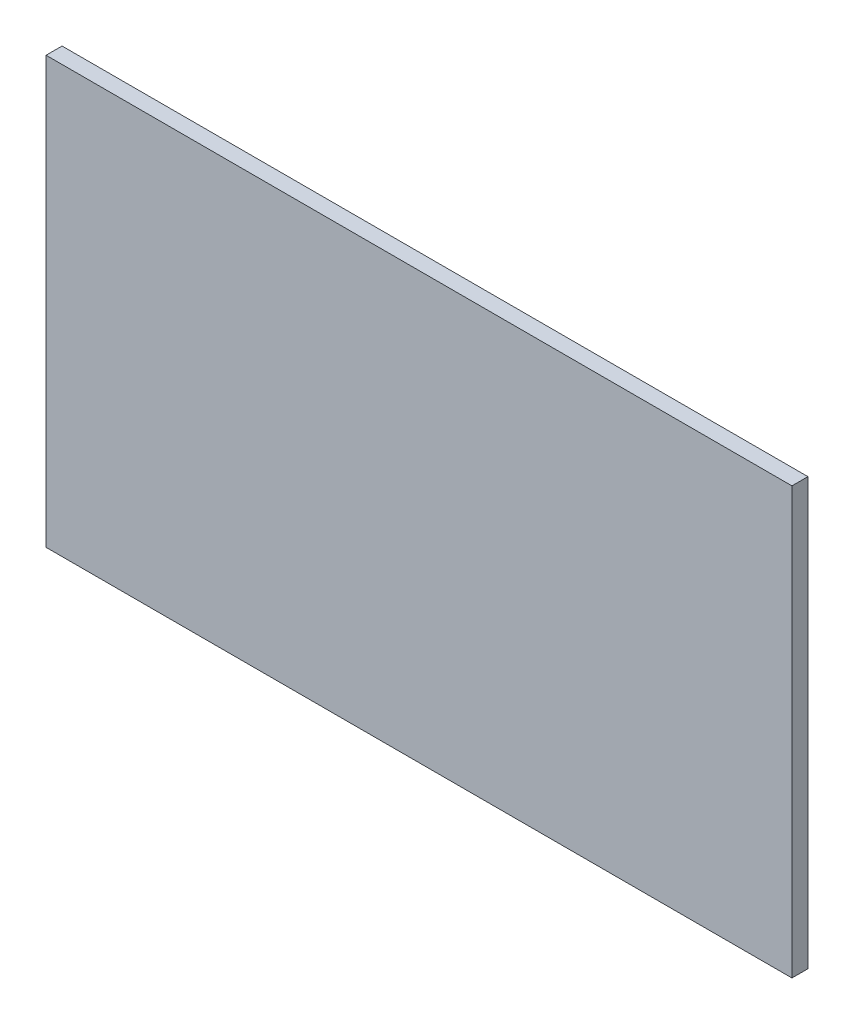
ISO-10303-21;
HEADER;
FILE_DESCRIPTION(('STEP AP214'),'2;1');
FILE_NAME('part.step','',(''),(''),'','','');
FILE_SCHEMA(('AUTOMOTIVE_DESIGN { 1 0 10303 214 1 1 1 1 }'));
ENDSEC;
DATA;
#1=APPLICATION_CONTEXT('core data for automotive mechanical design processes');
#2=APPLICATION_PROTOCOL_DEFINITION('international standard','automotive_design',2000,#1);
#3=PRODUCT_CONTEXT('',#1,'mechanical');
#4=PRODUCT('Part','Part','',(#3));
#5=PRODUCT_RELATED_PRODUCT_CATEGORY('part','',(#4));
#6=PRODUCT_DEFINITION_FORMATION('','',#4);
#7=PRODUCT_DEFINITION_CONTEXT('part definition',#1,'design');
#8=PRODUCT_DEFINITION('design','',#6,#7);
#9=PRODUCT_DEFINITION_SHAPE('','',#8);
#10=(LENGTH_UNIT() NAMED_UNIT(*) SI_UNIT(.MILLI.,.METRE.));
#11=(NAMED_UNIT(*) PLANE_ANGLE_UNIT() SI_UNIT($,.RADIAN.));
#12=(NAMED_UNIT(*) SI_UNIT($,.STERADIAN.) SOLID_ANGLE_UNIT());
#13=UNCERTAINTY_MEASURE_WITH_UNIT(LENGTH_MEASURE(1.E-05),#10,'distance_accuracy_value','');
#14=(GEOMETRIC_REPRESENTATION_CONTEXT(3) GLOBAL_UNCERTAINTY_ASSIGNED_CONTEXT((#13)) GLOBAL_UNIT_ASSIGNED_CONTEXT((#10,
#11,#12)) REPRESENTATION_CONTEXT('',''));
#15=CARTESIAN_POINT('',(0.,0.,0.));
#16=DIRECTION('',(0.,0.,1.));
#17=DIRECTION('',(1.,0.,0.));
#18=AXIS2_PLACEMENT_3D('',#15,#16,#17);
#19=CARTESIAN_POINT('',(0.,0.,3.));
#20=DIRECTION('',(1.,0.,0.));
#21=DIRECTION('',(0.,0.,-1.));
#22=AXIS2_PLACEMENT_3D('',#19,#20,#21);
#23=PLANE('',#22);
#24=DIRECTION('',(0.,-1.,0.));
#25=VECTOR('',#24,1.);
#26=CARTESIAN_POINT('',(0.,0.,0.));
#27=LINE('',#26,#25);
#28=CARTESIAN_POINT('',(0.,80.,0.));
#29=VERTEX_POINT('',#28);
#30=CARTESIAN_POINT('',(0.,0.,0.));
#31=VERTEX_POINT('',#30);
#32=EDGE_CURVE('E107',#29,#31,#27,.T.);
#33=ORIENTED_EDGE('',*,*,#32,.T.);
#34=DIRECTION('',(0.,0.,-1.));
#35=VECTOR('',#34,1.);
#36=CARTESIAN_POINT('',(0.,0.,3.));
#37=LINE('',#36,#35);
#38=CARTESIAN_POINT('',(0.,0.,3.));
#39=VERTEX_POINT('',#38);
#40=EDGE_CURVE('E11',#39,#31,#37,.T.);
#41=ORIENTED_EDGE('',*,*,#40,.F.);
#42=DIRECTION('',(0.,-1.,0.));
#43=VECTOR('',#42,1.);
#44=CARTESIAN_POINT('',(0.,0.,3.));
#45=LINE('',#44,#43);
#46=CARTESIAN_POINT('',(0.,80.,3.));
#47=VERTEX_POINT('',#46);
#48=EDGE_CURVE('E91',#47,#39,#45,.T.);
#49=ORIENTED_EDGE('',*,*,#48,.F.);
#50=DIRECTION('',(0.,0.,-1.));
#51=VECTOR('',#50,1.);
#52=CARTESIAN_POINT('',(0.,80.,3.));
#53=LINE('',#52,#51);
#54=EDGE_CURVE('E103',#47,#29,#53,.T.);
#55=ORIENTED_EDGE('',*,*,#54,.T.);
#56=EDGE_LOOP('',(#33,#41,#49,#55));
#57=FACE_BOUND('',#56,.T.);
#58=ADVANCED_FACE('F39',(#57),#23,.F.);
#59=CARTESIAN_POINT('',(0.,0.,3.));
#60=DIRECTION('',(0.,1.,0.));
#61=DIRECTION('',(0.,0.,1.));
#62=AXIS2_PLACEMENT_3D('',#59,#60,#61);
#63=PLANE('',#62);
#64=DIRECTION('',(1.,0.,0.));
#65=VECTOR('',#64,1.);
#66=CARTESIAN_POINT('',(0.,0.,0.));
#67=LINE('',#66,#65);
#68=CARTESIAN_POINT('',(140.,0.,0.));
#69=VERTEX_POINT('',#68);
#70=EDGE_CURVE('E96',#31,#69,#67,.T.);
#71=ORIENTED_EDGE('',*,*,#70,.T.);
#72=DIRECTION('',(0.,0.,-1.));
#73=VECTOR('',#72,1.);
#74=CARTESIAN_POINT('',(140.,0.,3.));
#75=LINE('',#74,#73);
#76=CARTESIAN_POINT('',(140.,0.,3.));
#77=VERTEX_POINT('',#76);
#78=EDGE_CURVE('E48',#77,#69,#75,.T.);
#79=ORIENTED_EDGE('',*,*,#78,.F.);
#80=DIRECTION('',(1.,0.,0.));
#81=VECTOR('',#80,1.);
#82=CARTESIAN_POINT('',(0.,0.,3.));
#83=LINE('',#82,#81);
#84=EDGE_CURVE('E86',#39,#77,#83,.T.);
#85=ORIENTED_EDGE('',*,*,#84,.F.);
#86=ORIENTED_EDGE('',*,*,#40,.T.);
#87=EDGE_LOOP('',(#71,#79,#85,#86));
#88=FACE_BOUND('',#87,.T.);
#89=ADVANCED_FACE('F95',(#88),#63,.F.);
#90=CARTESIAN_POINT('',(140.,0.,3.));
#91=DIRECTION('',(-1.,0.,0.));
#92=DIRECTION('',(0.,0.,1.));
#93=AXIS2_PLACEMENT_3D('',#90,#91,#92);
#94=PLANE('',#93);
#95=DIRECTION('',(0.,1.,0.));
#96=VECTOR('',#95,1.);
#97=CARTESIAN_POINT('',(140.,0.,0.));
#98=LINE('',#97,#96);
#99=CARTESIAN_POINT('',(140.,80.,0.));
#100=VERTEX_POINT('',#99);
#101=EDGE_CURVE('E73',#69,#100,#98,.T.);
#102=ORIENTED_EDGE('',*,*,#101,.T.);
#103=DIRECTION('',(0.,0.,-1.));
#104=VECTOR('',#103,1.);
#105=CARTESIAN_POINT('',(140.,80.,3.));
#106=LINE('',#105,#104);
#107=CARTESIAN_POINT('',(140.,80.,3.));
#108=VERTEX_POINT('',#107);
#109=EDGE_CURVE('E98',#108,#100,#106,.T.);
#110=ORIENTED_EDGE('',*,*,#109,.F.);
#111=DIRECTION('',(0.,1.,0.));
#112=VECTOR('',#111,1.);
#113=CARTESIAN_POINT('',(140.,0.,3.));
#114=LINE('',#113,#112);
#115=EDGE_CURVE('E89',#77,#108,#114,.T.);
#116=ORIENTED_EDGE('',*,*,#115,.F.);
#117=ORIENTED_EDGE('',*,*,#78,.T.);
#118=EDGE_LOOP('',(#102,#110,#116,#117));
#119=FACE_BOUND('',#118,.T.);
#120=ADVANCED_FACE('F99',(#119),#94,.F.);
#121=CARTESIAN_POINT('',(0.,80.,3.));
#122=DIRECTION('',(0.,-1.,0.));
#123=DIRECTION('',(0.,0.,-1.));
#124=AXIS2_PLACEMENT_3D('',#121,#122,#123);
#125=PLANE('',#124);
#126=DIRECTION('',(-1.,0.,0.));
#127=VECTOR('',#126,1.);
#128=CARTESIAN_POINT('',(0.,80.,0.));
#129=LINE('',#128,#127);
#130=EDGE_CURVE('E79',#100,#29,#129,.T.);
#131=ORIENTED_EDGE('',*,*,#130,.T.);
#132=ORIENTED_EDGE('',*,*,#54,.F.);
#133=DIRECTION('',(-1.,0.,0.));
#134=VECTOR('',#133,1.);
#135=CARTESIAN_POINT('',(0.,80.,3.));
#136=LINE('',#135,#134);
#137=EDGE_CURVE('E56',#108,#47,#136,.T.);
#138=ORIENTED_EDGE('',*,*,#137,.F.);
#139=ORIENTED_EDGE('',*,*,#109,.T.);
#140=EDGE_LOOP('',(#131,#132,#138,#139));
#141=FACE_BOUND('',#140,.T.);
#142=ADVANCED_FACE('F120',(#141),#125,.F.);
#143=CARTESIAN_POINT('',(0.,0.,3.));
#144=DIRECTION('',(0.,0.,-1.));
#145=DIRECTION('',(-1.,0.,0.));
#146=AXIS2_PLACEMENT_3D('',#143,#144,#145);
#147=PLANE('',#146);
#148=ORIENTED_EDGE('',*,*,#48,.T.);
#149=ORIENTED_EDGE('',*,*,#84,.T.);
#150=ORIENTED_EDGE('',*,*,#115,.T.);
#151=ORIENTED_EDGE('',*,*,#137,.T.);
#152=EDGE_LOOP('',(#148,#149,#150,#151));
#153=FACE_BOUND('',#152,.T.);
#154=ADVANCED_FACE('F87',(#153),#147,.F.);
#155=CARTESIAN_POINT('',(0.,0.,0.));
#156=DIRECTION('',(0.,0.,-1.));
#157=DIRECTION('',(-1.,0.,0.));
#158=AXIS2_PLACEMENT_3D('',#155,#156,#157);
#159=PLANE('',#158);
#160=ORIENTED_EDGE('',*,*,#32,.F.);
#161=ORIENTED_EDGE('',*,*,#130,.F.);
#162=ORIENTED_EDGE('',*,*,#101,.F.);
#163=ORIENTED_EDGE('',*,*,#70,.F.);
#164=EDGE_LOOP('',(#160,#161,#162,#163));
#165=FACE_BOUND('',#164,.T.);
#166=ADVANCED_FACE('F123',(#165),#159,.T.);
#167=CLOSED_SHELL('',(#58,#89,#120,#142,#154,#166));
#168=MANIFOLD_SOLID_BREP('B2',#167);
#169=ADVANCED_BREP_SHAPE_REPRESENTATION('',(#18,#168),#14);
#170=SHAPE_DEFINITION_REPRESENTATION(#9,#169);
ENDSEC;
END-ISO-10303-21;
